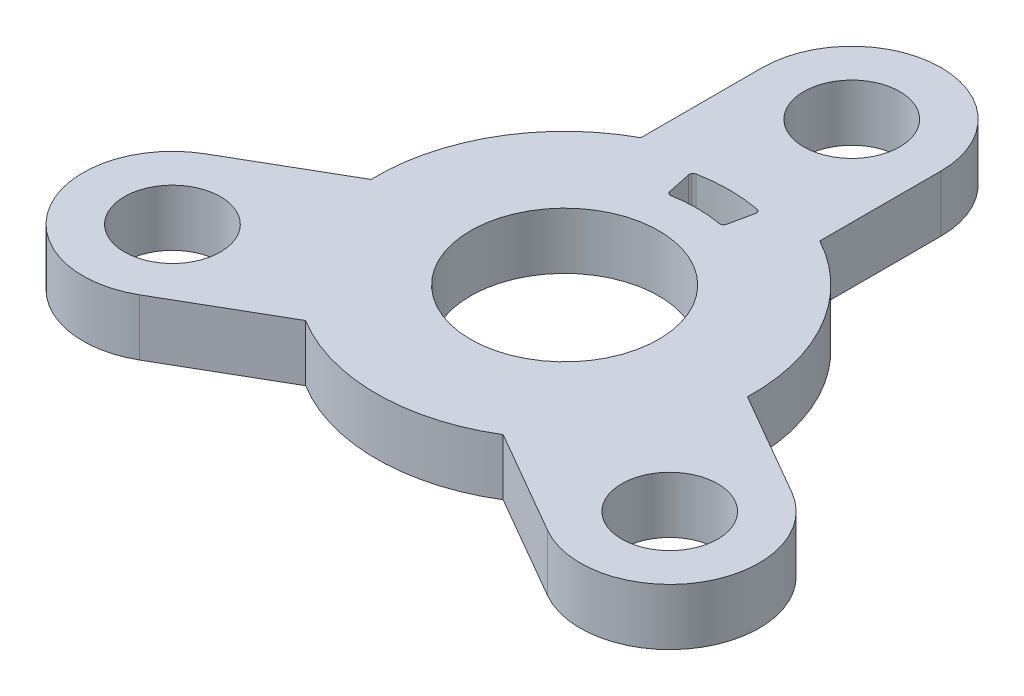
ISO-10303-21;
HEADER;
FILE_DESCRIPTION(('STEP AP214'),'2;1');
FILE_NAME('part.step','',(''),(''),'','','');
FILE_SCHEMA(('AUTOMOTIVE_DESIGN { 1 0 10303 214 1 1 1 1 }'));
ENDSEC;
DATA;
#1=APPLICATION_CONTEXT('core data for automotive mechanical design processes');
#2=APPLICATION_PROTOCOL_DEFINITION('international standard','automotive_design',2000,#1);
#3=PRODUCT_CONTEXT('',#1,'mechanical');
#4=PRODUCT('Part','Part','',(#3));
#5=PRODUCT_RELATED_PRODUCT_CATEGORY('part','',(#4));
#6=PRODUCT_DEFINITION_FORMATION('','',#4);
#7=PRODUCT_DEFINITION_CONTEXT('part definition',#1,'design');
#8=PRODUCT_DEFINITION('design','',#6,#7);
#9=PRODUCT_DEFINITION_SHAPE('','',#8);
#10=(LENGTH_UNIT() NAMED_UNIT(*) SI_UNIT(.MILLI.,.METRE.));
#11=(NAMED_UNIT(*) PLANE_ANGLE_UNIT() SI_UNIT($,.RADIAN.));
#12=(NAMED_UNIT(*) SI_UNIT($,.STERADIAN.) SOLID_ANGLE_UNIT());
#13=UNCERTAINTY_MEASURE_WITH_UNIT(LENGTH_MEASURE(1.E-05),#10,'distance_accuracy_value','');
#14=(GEOMETRIC_REPRESENTATION_CONTEXT(3) GLOBAL_UNCERTAINTY_ASSIGNED_CONTEXT((#13)) GLOBAL_UNIT_ASSIGNED_CONTEXT((#10,
#11,#12)) REPRESENTATION_CONTEXT('',''));
#15=CARTESIAN_POINT('',(0.,0.,0.));
#16=DIRECTION('',(0.,0.,1.));
#17=DIRECTION('',(1.,0.,0.));
#18=AXIS2_PLACEMENT_3D('',#15,#16,#17);
#19=CARTESIAN_POINT('',(0.,3.,0.));
#20=DIRECTION('',(0.,-1.,0.));
#21=DIRECTION('',(0.,0.,-1.));
#22=AXIS2_PLACEMENT_3D('',#19,#20,#21);
#23=CYLINDRICAL_SURFACE('',#22,10.);
#24=CARTESIAN_POINT('',(0.,3.,0.));
#25=DIRECTION('',(0.,1.,0.));
#26=DIRECTION('',(0.,0.,1.));
#27=AXIS2_PLACEMENT_3D('',#24,#25,#26);
#28=CIRCLE('',#27,10.);
#29=CARTESIAN_POINT('',(9.99590053733809,3.,0.286308308723334));
#30=VERTEX_POINT('',#29);
#31=CARTESIAN_POINT('',(4.75,3.,-8.79985795339902));
#32=VERTEX_POINT('',#31);
#33=EDGE_CURVE('E289',#30,#32,#28,.T.);
#34=ORIENTED_EDGE('',*,*,#33,.F.);
#35=DIRECTION('',(0.,1.,0.));
#36=VECTOR('',#35,1.);
#37=CARTESIAN_POINT('',(9.99590053733809,-17.5415408110455,0.286308308723334));
#38=LINE('',#37,#36);
#39=CARTESIAN_POINT('',(9.99590053733809,0.,0.286308308723334));
#40=VERTEX_POINT('',#39);
#41=EDGE_CURVE('E182',#40,#30,#38,.T.);
#42=ORIENTED_EDGE('',*,*,#41,.F.);
#43=CARTESIAN_POINT('',(0.,0.,0.));
#44=DIRECTION('',(0.,1.,0.));
#45=DIRECTION('',(0.,0.,1.));
#46=AXIS2_PLACEMENT_3D('',#43,#44,#45);
#47=CIRCLE('',#46,10.);
#48=CARTESIAN_POINT('',(4.75,0.,-8.79985795339902));
#49=VERTEX_POINT('',#48);
#50=EDGE_CURVE('E282',#40,#49,#47,.T.);
#51=ORIENTED_EDGE('',*,*,#50,.T.);
#52=DIRECTION('',(0.,1.,0.));
#53=VECTOR('',#52,1.);
#54=CARTESIAN_POINT('',(4.75,-14.6864965823725,-8.79985795339902));
#55=LINE('',#54,#53);
#56=EDGE_CURVE('E269',#49,#32,#55,.T.);
#57=ORIENTED_EDGE('',*,*,#56,.T.);
#58=EDGE_LOOP('',(#34,#42,#51,#57));
#59=FACE_BOUND('',#58,.T.);
#60=ADVANCED_FACE('F33',(#59),#23,.T.);
#61=CARTESIAN_POINT('',(-5.24590053733805,0.,8.51354964467562));
#62=VERTEX_POINT('',#61);
#63=CARTESIAN_POINT('',(5.24590053733817,0.,8.51354964467555));
#64=VERTEX_POINT('',#63);
#65=EDGE_CURVE('E292',#62,#64,#47,.T.);
#66=ORIENTED_EDGE('',*,*,#65,.T.);
#67=DIRECTION('',(0.,1.,0.));
#68=VECTOR('',#67,1.);
#69=CARTESIAN_POINT('',(5.24590053733817,-17.5415408110455,8.51354964467555));
#70=LINE('',#69,#68);
#71=CARTESIAN_POINT('',(5.24590053733817,3.,8.51354964467555));
#72=VERTEX_POINT('',#71);
#73=EDGE_CURVE('E208',#64,#72,#70,.T.);
#74=ORIENTED_EDGE('',*,*,#73,.T.);
#75=CARTESIAN_POINT('',(-5.24590053733805,3.,8.51354964467562));
#76=VERTEX_POINT('',#75);
#77=EDGE_CURVE('E288',#76,#72,#28,.T.);
#78=ORIENTED_EDGE('',*,*,#77,.F.);
#79=DIRECTION('',(0.,1.,0.));
#80=VECTOR('',#79,1.);
#81=CARTESIAN_POINT('',(-5.24590053733805,-17.5415408110455,8.51354964467562));
#82=LINE('',#81,#80);
#83=EDGE_CURVE('E240',#62,#76,#82,.T.);
#84=ORIENTED_EDGE('',*,*,#83,.F.);
#85=EDGE_LOOP('',(#66,#74,#78,#84));
#86=FACE_BOUND('',#85,.T.);
#87=ADVANCED_FACE('F364',(#86),#23,.T.);
#88=CARTESIAN_POINT('',(0.,3.,0.));
#89=DIRECTION('',(0.,1.,0.));
#90=DIRECTION('',(0.,0.,1.));
#91=AXIS2_PLACEMENT_3D('',#88,#89,#90);
#92=PLANE('',#91);
#93=CARTESIAN_POINT('',(0.,3.,0.));
#94=DIRECTION('',(0.,-1.,0.));
#95=DIRECTION('',(0.,0.,-1.));
#96=AXIS2_PLACEMENT_3D('',#93,#94,#95);
#97=CIRCLE('',#96,7.05);
#98=CARTESIAN_POINT('',(-1.2749867429514,3.,-6.93375142367378));
#99=VERTEX_POINT('',#98);
#100=CARTESIAN_POINT('',(1.27498674295145,3.,-6.93375142367377));
#101=VERTEX_POINT('',#100);
#102=EDGE_CURVE('E349',#99,#101,#97,.T.);
#103=ORIENTED_EDGE('',*,*,#102,.F.);
#104=CARTESIAN_POINT('',(-1.31115657963088,3.,-7.13045359172126));
#105=DIRECTION('',(0.,1.,0.));
#106=DIRECTION('',(0.,0.,1.));
#107=AXIS2_PLACEMENT_3D('',#104,#105,#106);
#108=CIRCLE('',#107,0.2);
#109=CARTESIAN_POINT('',(-1.50678609977764,3.,-7.08887125355771));
#110=VERTEX_POINT('',#109);
#111=EDGE_CURVE('E311',#99,#110,#108,.F.);
#112=ORIENTED_EDGE('',*,*,#111,.T.);
#113=DIRECTION('',(0.207911690817753,0.,0.978147600733807));
#114=VECTOR('',#113,1.);
#115=CARTESIAN_POINT('',(-1.81922729465534,3.,-8.55879150642081));
#116=LINE('',#115,#114);
#117=CARTESIAN_POINT('',(-1.77715854680823,3.,-8.36087360863124));
#118=VERTEX_POINT('',#117);
#119=EDGE_CURVE('E327',#118,#110,#116,.T.);
#120=ORIENTED_EDGE('',*,*,#119,.F.);
#121=CARTESIAN_POINT('',(-1.58152902666147,3.,-8.4024559467948));
#122=DIRECTION('',(0.,1.,0.));
#123=DIRECTION('',(0.,0.,1.));
#124=AXIS2_PLACEMENT_3D('',#121,#122,#123);
#125=CIRCLE('',#124,0.2);
#126=CARTESIAN_POINT('',(-1.61852385769448,3.,-8.5990046239128));
#127=VERTEX_POINT('',#126);
#128=EDGE_CURVE('E41',#118,#127,#125,.F.);
#129=ORIENTED_EDGE('',*,*,#128,.T.);
#130=CARTESIAN_POINT('',(0.,3.,0.));
#131=DIRECTION('',(0.,1.,0.));
#132=DIRECTION('',(0.,0.,-1.));
#133=AXIS2_PLACEMENT_3D('',#130,#131,#132);
#134=CIRCLE('',#133,8.75);
#135=CARTESIAN_POINT('',(1.61852385769455,3.,-8.59900462391279));
#136=VERTEX_POINT('',#135);
#137=EDGE_CURVE('E325',#136,#127,#134,.T.);
#138=ORIENTED_EDGE('',*,*,#137,.F.);
#139=CARTESIAN_POINT('',(1.58152902666153,3.,-8.40245594679478));
#140=DIRECTION('',(0.,1.,0.));
#141=DIRECTION('',(0.,0.,1.));
#142=AXIS2_PLACEMENT_3D('',#139,#140,#141);
#143=CIRCLE('',#142,0.2);
#144=CARTESIAN_POINT('',(1.77715854680829,3.,-8.36087360863123));
#145=VERTEX_POINT('',#144);
#146=EDGE_CURVE('E319',#136,#145,#143,.F.);
#147=ORIENTED_EDGE('',*,*,#146,.T.);
#148=DIRECTION('',(0.20791169081776,0.,-0.978147600733806));
#149=VECTOR('',#148,1.);
#150=CARTESIAN_POINT('',(1.8192272946554,3.,-8.5587915064208));
#151=LINE('',#150,#149);
#152=CARTESIAN_POINT('',(1.50678609977769,3.,-7.0888712535577));
#153=VERTEX_POINT('',#152);
#154=EDGE_CURVE('E332',#153,#145,#151,.T.);
#155=ORIENTED_EDGE('',*,*,#154,.F.);
#156=CARTESIAN_POINT('',(1.31115657963093,3.,-7.13045359172125));
#157=DIRECTION('',(0.,1.,0.));
#158=DIRECTION('',(0.,0.,1.));
#159=AXIS2_PLACEMENT_3D('',#156,#157,#158);
#160=CIRCLE('',#159,0.2);
#161=EDGE_CURVE('E315',#153,#101,#160,.F.);
#162=ORIENTED_EDGE('',*,*,#161,.T.);
#163=EDGE_LOOP('',(#103,#112,#120,#129,#138,#147,#155,#162));
#164=FACE_BOUND('',#163,.T.);
#165=CARTESIAN_POINT('',(-4.75,3.,-8.79985795339902));
#166=VERTEX_POINT('',#165);
#167=CARTESIAN_POINT('',(-9.99590053733809,3.,0.286308308723472));
#168=VERTEX_POINT('',#167);
#169=EDGE_CURVE('E285',#166,#168,#28,.T.);
#170=ORIENTED_EDGE('',*,*,#169,.T.);
#171=DIRECTION('',(-0.866025403784436,0.,0.500000000000004));
#172=VECTOR('',#171,1.);
#173=CARTESIAN_POINT('',(-15.5818874077127,3.,3.51137933202399));
#174=LINE('',#173,#172);
#175=CARTESIAN_POINT('',(-15.5818874077127,3.,3.51137933202399));
#176=VERTEX_POINT('',#175);
#177=EDGE_CURVE('E233',#168,#176,#174,.T.);
#178=ORIENTED_EDGE('',*,*,#177,.T.);
#179=CARTESIAN_POINT('',(-13.2068874077127,3.,7.62500000000006));
#180=DIRECTION('',(0.,1.,0.));
#181=DIRECTION('',(0.866025403784436,0.,-0.500000000000004));
#182=AXIS2_PLACEMENT_3D('',#179,#180,#181);
#183=CIRCLE('',#182,4.75);
#184=CARTESIAN_POINT('',(-10.8318874077126,3.,11.7386206679761));
#185=VERTEX_POINT('',#184);
#186=EDGE_CURVE('E227',#176,#185,#183,.T.);
#187=ORIENTED_EDGE('',*,*,#186,.T.);
#188=DIRECTION('',(0.866025403784436,0.,-0.500000000000004));
#189=VECTOR('',#188,1.);
#190=CARTESIAN_POINT('',(-10.8318874077126,3.,11.7386206679761));
#191=LINE('',#190,#189);
#192=EDGE_CURVE('E230',#185,#76,#191,.T.);
#193=ORIENTED_EDGE('',*,*,#192,.T.);
#194=ORIENTED_EDGE('',*,*,#77,.T.);
#195=DIRECTION('',(0.866025403784443,0.,0.499999999999992));
#196=VECTOR('',#195,1.);
#197=CARTESIAN_POINT('',(10.8318874077128,3.,11.738620667976));
#198=LINE('',#197,#196);
#199=CARTESIAN_POINT('',(10.8318874077128,3.,11.738620667976));
#200=VERTEX_POINT('',#199);
#201=EDGE_CURVE('E183',#72,#200,#198,.T.);
#202=ORIENTED_EDGE('',*,*,#201,.T.);
#203=CARTESIAN_POINT('',(13.2068874077128,3.,7.62499999999988));
#204=DIRECTION('',(0.,1.,0.));
#205=DIRECTION('',(-0.866025403784443,0.,-0.499999999999992));
#206=AXIS2_PLACEMENT_3D('',#203,#204,#205);
#207=CIRCLE('',#206,4.75);
#208=CARTESIAN_POINT('',(15.5818874077127,3.,3.51137933202377));
#209=VERTEX_POINT('',#208);
#210=EDGE_CURVE('E177',#200,#209,#207,.T.);
#211=ORIENTED_EDGE('',*,*,#210,.T.);
#212=DIRECTION('',(-0.866025403784443,0.,-0.499999999999992));
#213=VECTOR('',#212,1.);
#214=CARTESIAN_POINT('',(15.5818874077127,3.,3.51137933202377));
#215=LINE('',#214,#213);
#216=EDGE_CURVE('E187',#209,#30,#215,.T.);
#217=ORIENTED_EDGE('',*,*,#216,.T.);
#218=ORIENTED_EDGE('',*,*,#33,.T.);
#219=DIRECTION('',(0.,0.,-1.));
#220=VECTOR('',#219,1.);
#221=CARTESIAN_POINT('',(4.75,3.,-15.25));
#222=LINE('',#221,#220);
#223=CARTESIAN_POINT('',(4.75,3.,-15.25));
#224=VERTEX_POINT('',#223);
#225=EDGE_CURVE('E264',#32,#224,#222,.T.);
#226=ORIENTED_EDGE('',*,*,#225,.T.);
#227=CARTESIAN_POINT('',(0.,3.,-15.25));
#228=DIRECTION('',(0.,1.,0.));
#229=DIRECTION('',(0.,0.,1.));
#230=AXIS2_PLACEMENT_3D('',#227,#228,#229);
#231=CIRCLE('',#230,4.75);
#232=CARTESIAN_POINT('',(-4.75,3.,-15.25));
#233=VERTEX_POINT('',#232);
#234=EDGE_CURVE('E258',#224,#233,#231,.T.);
#235=ORIENTED_EDGE('',*,*,#234,.T.);
#236=DIRECTION('',(0.,0.,1.));
#237=VECTOR('',#236,1.);
#238=CARTESIAN_POINT('',(-4.75,3.,-15.25));
#239=LINE('',#238,#237);
#240=EDGE_CURVE('E261',#233,#166,#239,.T.);
#241=ORIENTED_EDGE('',*,*,#240,.T.);
#242=EDGE_LOOP('',(#170,#178,#187,#193,#194,#202,#211,#217,#218,#226,#235,#241));
#243=FACE_BOUND('',#242,.T.);
#244=CARTESIAN_POINT('',(0.,3.,0.));
#245=DIRECTION('',(0.,1.,0.));
#246=DIRECTION('',(0.,0.,1.));
#247=AXIS2_PLACEMENT_3D('',#244,#245,#246);
#248=CIRCLE('',#247,5.);
#249=CARTESIAN_POINT('',(0.,3.,5.));
#250=VERTEX_POINT('',#249);
#251=EDGE_CURVE('E279',#250,#250,#248,.T.);
#252=ORIENTED_EDGE('',*,*,#251,.F.);
#253=EDGE_LOOP('',(#252));
#254=FACE_BOUND('',#253,.T.);
#255=CARTESIAN_POINT('',(0.,3.,-15.25));
#256=DIRECTION('',(0.,1.,0.));
#257=DIRECTION('',(0.,0.,1.));
#258=AXIS2_PLACEMENT_3D('',#255,#256,#257);
#259=CIRCLE('',#258,2.55);
#260=CARTESIAN_POINT('',(0.,3.,-12.7));
#261=VERTEX_POINT('',#260);
#262=EDGE_CURVE('E246',#261,#261,#259,.T.);
#263=ORIENTED_EDGE('',*,*,#262,.F.);
#264=EDGE_LOOP('',(#263));
#265=FACE_BOUND('',#264,.T.);
#266=CARTESIAN_POINT('',(-13.2068874077127,3.,7.62500000000006));
#267=DIRECTION('',(0.,1.,0.));
#268=DIRECTION('',(0.866025403784436,0.,-0.500000000000004));
#269=AXIS2_PLACEMENT_3D('',#266,#267,#268);
#270=CIRCLE('',#269,2.55);
#271=CARTESIAN_POINT('',(-13.2068874077127,3.,10.1750000000001));
#272=VERTEX_POINT('',#271);
#273=EDGE_CURVE('E214',#272,#272,#270,.T.);
#274=ORIENTED_EDGE('',*,*,#273,.F.);
#275=EDGE_LOOP('',(#274));
#276=FACE_BOUND('',#275,.T.);
#277=CARTESIAN_POINT('',(13.2068874077128,3.,7.62499999999988));
#278=DIRECTION('',(0.,1.,0.));
#279=DIRECTION('',(-0.866025403784443,0.,-0.499999999999992));
#280=AXIS2_PLACEMENT_3D('',#277,#278,#279);
#281=CIRCLE('',#280,2.55);
#282=CARTESIAN_POINT('',(10.9985226280624,3.,6.3499999999999));
#283=VERTEX_POINT('',#282);
#284=EDGE_CURVE('E197',#283,#283,#281,.T.);
#285=ORIENTED_EDGE('',*,*,#284,.F.);
#286=EDGE_LOOP('',(#285));
#287=FACE_BOUND('',#286,.T.);
#288=ADVANCED_FACE('F193',(#164,#243,#254,#265,#276,#287),#92,.T.);
#289=CARTESIAN_POINT('',(0.,0.,0.));
#290=DIRECTION('',(0.,1.,0.));
#291=DIRECTION('',(0.,0.,1.));
#292=AXIS2_PLACEMENT_3D('',#289,#290,#291);
#293=PLANE('',#292);
#294=CARTESIAN_POINT('',(0.,0.,0.));
#295=DIRECTION('',(0.,1.,0.));
#296=DIRECTION('',(0.,0.,-1.));
#297=AXIS2_PLACEMENT_3D('',#294,#295,#296);
#298=CIRCLE('',#297,8.75);
#299=CARTESIAN_POINT('',(1.61852385769455,0.,-8.59900462391279));
#300=VERTEX_POINT('',#299);
#301=CARTESIAN_POINT('',(-1.61852385769448,0.,-8.5990046239128));
#302=VERTEX_POINT('',#301);
#303=EDGE_CURVE('E340',#300,#302,#298,.T.);
#304=ORIENTED_EDGE('',*,*,#303,.T.);
#305=CARTESIAN_POINT('',(-1.58152902666147,0.,-8.4024559467948));
#306=DIRECTION('',(0.,1.,0.));
#307=DIRECTION('',(0.,0.,1.));
#308=AXIS2_PLACEMENT_3D('',#305,#306,#307);
#309=CIRCLE('',#308,0.2);
#310=CARTESIAN_POINT('',(-1.77715854680823,0.,-8.36087360863124));
#311=VERTEX_POINT('',#310);
#312=EDGE_CURVE('E11',#302,#311,#309,.T.);
#313=ORIENTED_EDGE('',*,*,#312,.T.);
#314=DIRECTION('',(0.207911690817753,0.,0.978147600733807));
#315=VECTOR('',#314,1.);
#316=CARTESIAN_POINT('',(-1.81922729465534,0.,-8.55879150642081));
#317=LINE('',#316,#315);
#318=CARTESIAN_POINT('',(-1.50678609977764,0.,-7.08887125355771));
#319=VERTEX_POINT('',#318);
#320=EDGE_CURVE('E200',#311,#319,#317,.T.);
#321=ORIENTED_EDGE('',*,*,#320,.T.);
#322=CARTESIAN_POINT('',(-1.31115657963088,0.,-7.13045359172126));
#323=DIRECTION('',(0.,1.,0.));
#324=DIRECTION('',(0.,0.,1.));
#325=AXIS2_PLACEMENT_3D('',#322,#323,#324);
#326=CIRCLE('',#325,0.2);
#327=CARTESIAN_POINT('',(-1.2749867429514,0.,-6.93375142367378));
#328=VERTEX_POINT('',#327);
#329=EDGE_CURVE('E313',#319,#328,#326,.T.);
#330=ORIENTED_EDGE('',*,*,#329,.T.);
#331=CARTESIAN_POINT('',(0.,0.,0.));
#332=DIRECTION('',(0.,-1.,0.));
#333=DIRECTION('',(0.,0.,-1.));
#334=AXIS2_PLACEMENT_3D('',#331,#332,#333);
#335=CIRCLE('',#334,7.05);
#336=CARTESIAN_POINT('',(1.27498674295145,0.,-6.93375142367377));
#337=VERTEX_POINT('',#336);
#338=EDGE_CURVE('E355',#328,#337,#335,.T.);
#339=ORIENTED_EDGE('',*,*,#338,.T.);
#340=CARTESIAN_POINT('',(1.31115657963093,0.,-7.13045359172125));
#341=DIRECTION('',(0.,1.,0.));
#342=DIRECTION('',(0.,0.,1.));
#343=AXIS2_PLACEMENT_3D('',#340,#341,#342);
#344=CIRCLE('',#343,0.2);
#345=CARTESIAN_POINT('',(1.50678609977769,0.,-7.0888712535577));
#346=VERTEX_POINT('',#345);
#347=EDGE_CURVE('E317',#337,#346,#344,.T.);
#348=ORIENTED_EDGE('',*,*,#347,.T.);
#349=DIRECTION('',(0.20791169081776,0.,-0.978147600733806));
#350=VECTOR('',#349,1.);
#351=CARTESIAN_POINT('',(1.8192272946554,0.,-8.5587915064208));
#352=LINE('',#351,#350);
#353=CARTESIAN_POINT('',(1.77715854680829,0.,-8.36087360863123));
#354=VERTEX_POINT('',#353);
#355=EDGE_CURVE('E345',#346,#354,#352,.T.);
#356=ORIENTED_EDGE('',*,*,#355,.T.);
#357=CARTESIAN_POINT('',(1.58152902666153,0.,-8.40245594679478));
#358=DIRECTION('',(0.,1.,0.));
#359=DIRECTION('',(0.,0.,1.));
#360=AXIS2_PLACEMENT_3D('',#357,#358,#359);
#361=CIRCLE('',#360,0.2);
#362=EDGE_CURVE('E55',#354,#300,#361,.T.);
#363=ORIENTED_EDGE('',*,*,#362,.T.);
#364=EDGE_LOOP('',(#304,#313,#321,#330,#339,#348,#356,#363));
#365=FACE_BOUND('',#364,.T.);
#366=CARTESIAN_POINT('',(-4.75,0.,-8.79985795339902));
#367=VERTEX_POINT('',#366);
#368=CARTESIAN_POINT('',(-9.99590053733809,0.,0.286308308723473));
#369=VERTEX_POINT('',#368);
#370=EDGE_CURVE('E290',#367,#369,#47,.T.);
#371=ORIENTED_EDGE('',*,*,#370,.F.);
#372=DIRECTION('',(0.,0.,-1.));
#373=VECTOR('',#372,1.);
#374=CARTESIAN_POINT('',(-4.75,0.,-15.25));
#375=LINE('',#374,#373);
#376=CARTESIAN_POINT('',(-4.75,0.,-15.25));
#377=VERTEX_POINT('',#376);
#378=EDGE_CURVE('E247',#367,#377,#375,.T.);
#379=ORIENTED_EDGE('',*,*,#378,.T.);
#380=CARTESIAN_POINT('',(0.,0.,-15.25));
#381=DIRECTION('',(0.,1.,0.));
#382=DIRECTION('',(0.,0.,1.));
#383=AXIS2_PLACEMENT_3D('',#380,#381,#382);
#384=CIRCLE('',#383,4.75);
#385=CARTESIAN_POINT('',(4.75,0.,-15.25));
#386=VERTEX_POINT('',#385);
#387=EDGE_CURVE('E250',#377,#386,#384,.F.);
#388=ORIENTED_EDGE('',*,*,#387,.T.);
#389=DIRECTION('',(0.,0.,1.));
#390=VECTOR('',#389,1.);
#391=CARTESIAN_POINT('',(4.75,0.,-15.25));
#392=LINE('',#391,#390);
#393=EDGE_CURVE('E251',#386,#49,#392,.T.);
#394=ORIENTED_EDGE('',*,*,#393,.T.);
#395=ORIENTED_EDGE('',*,*,#50,.F.);
#396=DIRECTION('',(0.866025403784443,0.,0.499999999999992));
#397=VECTOR('',#396,1.);
#398=CARTESIAN_POINT('',(15.5818874077127,0.,3.51137933202377));
#399=LINE('',#398,#397);
#400=CARTESIAN_POINT('',(15.5818874077127,0.,3.51137933202377));
#401=VERTEX_POINT('',#400);
#402=EDGE_CURVE('E215',#40,#401,#399,.T.);
#403=ORIENTED_EDGE('',*,*,#402,.T.);
#404=CARTESIAN_POINT('',(13.2068874077128,0.,7.62499999999988));
#405=DIRECTION('',(0.,1.,0.));
#406=DIRECTION('',(0.,0.,1.));
#407=AXIS2_PLACEMENT_3D('',#404,#405,#406);
#408=CIRCLE('',#407,4.75);
#409=CARTESIAN_POINT('',(10.8318874077128,0.,11.738620667976));
#410=VERTEX_POINT('',#409);
#411=EDGE_CURVE('E179',#401,#410,#408,.F.);
#412=ORIENTED_EDGE('',*,*,#411,.T.);
#413=DIRECTION('',(-0.866025403784443,0.,-0.499999999999992));
#414=VECTOR('',#413,1.);
#415=CARTESIAN_POINT('',(10.8318874077128,0.,11.738620667976));
#416=LINE('',#415,#414);
#417=EDGE_CURVE('E207',#410,#64,#416,.T.);
#418=ORIENTED_EDGE('',*,*,#417,.T.);
#419=ORIENTED_EDGE('',*,*,#65,.F.);
#420=DIRECTION('',(-0.866025403784436,0.,0.500000000000004));
#421=VECTOR('',#420,1.);
#422=CARTESIAN_POINT('',(-10.8318874077126,0.,11.7386206679761));
#423=LINE('',#422,#421);
#424=CARTESIAN_POINT('',(-10.8318874077126,0.,11.7386206679761));
#425=VERTEX_POINT('',#424);
#426=EDGE_CURVE('E216',#62,#425,#423,.T.);
#427=ORIENTED_EDGE('',*,*,#426,.T.);
#428=CARTESIAN_POINT('',(-13.2068874077127,0.,7.62500000000006));
#429=DIRECTION('',(0.,1.,0.));
#430=DIRECTION('',(0.,0.,1.));
#431=AXIS2_PLACEMENT_3D('',#428,#429,#430);
#432=CIRCLE('',#431,4.75);
#433=CARTESIAN_POINT('',(-15.5818874077127,0.,3.51137933202399));
#434=VERTEX_POINT('',#433);
#435=EDGE_CURVE('E219',#425,#434,#432,.F.);
#436=ORIENTED_EDGE('',*,*,#435,.T.);
#437=DIRECTION('',(0.866025403784436,0.,-0.500000000000004));
#438=VECTOR('',#437,1.);
#439=CARTESIAN_POINT('',(-15.5818874077127,0.,3.51137933202399));
#440=LINE('',#439,#438);
#441=EDGE_CURVE('E220',#434,#369,#440,.T.);
#442=ORIENTED_EDGE('',*,*,#441,.T.);
#443=EDGE_LOOP('',(#371,#379,#388,#394,#395,#403,#412,#418,#419,#427,#436,#442));
#444=FACE_BOUND('',#443,.T.);
#445=CARTESIAN_POINT('',(0.,0.,0.));
#446=DIRECTION('',(0.,1.,0.));
#447=DIRECTION('',(0.,0.,1.));
#448=AXIS2_PLACEMENT_3D('',#445,#446,#447);
#449=CIRCLE('',#448,5.);
#450=CARTESIAN_POINT('',(0.,0.,5.));
#451=VERTEX_POINT('',#450);
#452=EDGE_CURVE('E278',#451,#451,#449,.T.);
#453=ORIENTED_EDGE('',*,*,#452,.T.);
#454=EDGE_LOOP('',(#453));
#455=FACE_BOUND('',#454,.T.);
#456=CARTESIAN_POINT('',(0.,0.,-15.25));
#457=DIRECTION('',(0.,1.,0.));
#458=DIRECTION('',(0.,0.,1.));
#459=AXIS2_PLACEMENT_3D('',#456,#457,#458);
#460=CIRCLE('',#459,2.55);
#461=CARTESIAN_POINT('',(0.,0.,-12.7));
#462=VERTEX_POINT('',#461);
#463=EDGE_CURVE('E249',#462,#462,#460,.F.);
#464=ORIENTED_EDGE('',*,*,#463,.F.);
#465=EDGE_LOOP('',(#464));
#466=FACE_BOUND('',#465,.T.);
#467=CARTESIAN_POINT('',(-13.2068874077127,0.,7.62500000000006));
#468=DIRECTION('',(0.,1.,0.));
#469=DIRECTION('',(0.,0.,1.));
#470=AXIS2_PLACEMENT_3D('',#467,#468,#469);
#471=CIRCLE('',#470,2.55);
#472=CARTESIAN_POINT('',(-13.2068874077127,0.,10.1750000000001));
#473=VERTEX_POINT('',#472);
#474=EDGE_CURVE('E218',#473,#473,#471,.F.);
#475=ORIENTED_EDGE('',*,*,#474,.F.);
#476=EDGE_LOOP('',(#475));
#477=FACE_BOUND('',#476,.T.);
#478=CARTESIAN_POINT('',(13.2068874077128,0.,7.62499999999988));
#479=DIRECTION('',(0.,1.,0.));
#480=DIRECTION('',(0.,0.,1.));
#481=AXIS2_PLACEMENT_3D('',#478,#479,#480);
#482=CIRCLE('',#481,2.55);
#483=CARTESIAN_POINT('',(13.2068874077128,0.,10.1749999999999));
#484=VERTEX_POINT('',#483);
#485=EDGE_CURVE('E211',#484,#484,#482,.F.);
#486=ORIENTED_EDGE('',*,*,#485,.F.);
#487=EDGE_LOOP('',(#486));
#488=FACE_BOUND('',#487,.T.);
#489=ADVANCED_FACE('F337',(#365,#444,#455,#466,#477,#488),#293,.F.);
#490=ORIENTED_EDGE('',*,*,#370,.T.);
#491=DIRECTION('',(0.,1.,0.));
#492=VECTOR('',#491,1.);
#493=CARTESIAN_POINT('',(-9.99590053733809,-17.5415408110455,0.286308308723472));
#494=LINE('',#493,#492);
#495=EDGE_CURVE('E238',#369,#168,#494,.T.);
#496=ORIENTED_EDGE('',*,*,#495,.T.);
#497=ORIENTED_EDGE('',*,*,#169,.F.);
#498=DIRECTION('',(0.,1.,0.));
#499=VECTOR('',#498,1.);
#500=CARTESIAN_POINT('',(-4.75,-14.6864965823725,-8.79985795339902));
#501=LINE('',#500,#499);
#502=EDGE_CURVE('E272',#367,#166,#501,.T.);
#503=ORIENTED_EDGE('',*,*,#502,.F.);
#504=EDGE_LOOP('',(#490,#496,#497,#503));
#505=FACE_BOUND('',#504,.T.);
#506=ADVANCED_FACE('F386',(#505),#23,.T.);
#507=CARTESIAN_POINT('',(0.,3.,0.));
#508=DIRECTION('',(0.,-1.,0.));
#509=DIRECTION('',(0.,0.,-1.));
#510=AXIS2_PLACEMENT_3D('',#507,#508,#509);
#511=CYLINDRICAL_SURFACE('',#510,5.);
#512=ORIENTED_EDGE('',*,*,#251,.T.);
#513=EDGE_LOOP('',(#512));
#514=FACE_BOUND('',#513,.T.);
#515=ORIENTED_EDGE('',*,*,#452,.F.);
#516=EDGE_LOOP('',(#515));
#517=FACE_BOUND('',#516,.T.);
#518=ADVANCED_FACE('F419',(#514,#517),#511,.F.);
#519=CARTESIAN_POINT('',(-4.75,-14.6864965823725,-15.25));
#520=DIRECTION('',(-1.,0.,0.));
#521=DIRECTION('',(0.,0.,1.));
#522=AXIS2_PLACEMENT_3D('',#519,#520,#521);
#523=PLANE('',#522);
#524=ORIENTED_EDGE('',*,*,#378,.F.);
#525=ORIENTED_EDGE('',*,*,#502,.T.);
#526=ORIENTED_EDGE('',*,*,#240,.F.);
#527=DIRECTION('',(0.,1.,0.));
#528=VECTOR('',#527,1.);
#529=CARTESIAN_POINT('',(-4.75,-14.6864965823725,-15.25));
#530=LINE('',#529,#528);
#531=EDGE_CURVE('E267',#377,#233,#530,.T.);
#532=ORIENTED_EDGE('',*,*,#531,.F.);
#533=EDGE_LOOP('',(#524,#525,#526,#532));
#534=FACE_BOUND('',#533,.T.);
#535=ADVANCED_FACE('F383',(#534),#523,.T.);
#536=CARTESIAN_POINT('',(4.75,-14.6864965823725,-15.25));
#537=DIRECTION('',(1.,0.,0.));
#538=DIRECTION('',(0.,0.,-1.));
#539=AXIS2_PLACEMENT_3D('',#536,#537,#538);
#540=PLANE('',#539);
#541=ORIENTED_EDGE('',*,*,#393,.F.);
#542=DIRECTION('',(0.,1.,0.));
#543=VECTOR('',#542,1.);
#544=CARTESIAN_POINT('',(4.75,-14.6864965823725,-15.25));
#545=LINE('',#544,#543);
#546=EDGE_CURVE('E254',#386,#224,#545,.T.);
#547=ORIENTED_EDGE('',*,*,#546,.T.);
#548=ORIENTED_EDGE('',*,*,#225,.F.);
#549=ORIENTED_EDGE('',*,*,#56,.F.);
#550=EDGE_LOOP('',(#541,#547,#548,#549));
#551=FACE_BOUND('',#550,.T.);
#552=ADVANCED_FACE('F372',(#551),#540,.T.);
#553=CARTESIAN_POINT('',(0.,-14.6864965823725,-15.25));
#554=DIRECTION('',(0.,1.,0.));
#555=DIRECTION('',(0.,0.,1.));
#556=AXIS2_PLACEMENT_3D('',#553,#554,#555);
#557=CYLINDRICAL_SURFACE('',#556,4.75);
#558=ORIENTED_EDGE('',*,*,#387,.F.);
#559=ORIENTED_EDGE('',*,*,#531,.T.);
#560=ORIENTED_EDGE('',*,*,#234,.F.);
#561=ORIENTED_EDGE('',*,*,#546,.F.);
#562=EDGE_LOOP('',(#558,#559,#560,#561));
#563=FACE_BOUND('',#562,.T.);
#564=ADVANCED_FACE('F377',(#563),#557,.T.);
#565=CARTESIAN_POINT('',(0.,-14.6864965823725,-15.25));
#566=DIRECTION('',(0.,1.,0.));
#567=DIRECTION('',(0.,0.,1.));
#568=AXIS2_PLACEMENT_3D('',#565,#566,#567);
#569=CYLINDRICAL_SURFACE('',#568,2.55);
#570=ORIENTED_EDGE('',*,*,#463,.T.);
#571=EDGE_LOOP('',(#570));
#572=FACE_BOUND('',#571,.T.);
#573=ORIENTED_EDGE('',*,*,#262,.T.);
#574=EDGE_LOOP('',(#573));
#575=FACE_BOUND('',#574,.T.);
#576=ADVANCED_FACE('F401',(#572,#575),#569,.F.);
#577=CARTESIAN_POINT('',(-10.8318874077126,-17.5415408110455,11.7386206679761));
#578=DIRECTION('',(0.500000000000004,0.,0.866025403784436));
#579=DIRECTION('',(0.866025403784436,0.,-0.500000000000004));
#580=AXIS2_PLACEMENT_3D('',#577,#578,#579);
#581=PLANE('',#580);
#582=ORIENTED_EDGE('',*,*,#426,.F.);
#583=ORIENTED_EDGE('',*,*,#83,.T.);
#584=ORIENTED_EDGE('',*,*,#192,.F.);
#585=DIRECTION('',(0.,1.,0.));
#586=VECTOR('',#585,1.);
#587=CARTESIAN_POINT('',(-10.8318874077126,-17.5415408110455,11.7386206679761));
#588=LINE('',#587,#586);
#589=EDGE_CURVE('E236',#425,#185,#588,.T.);
#590=ORIENTED_EDGE('',*,*,#589,.F.);
#591=EDGE_LOOP('',(#582,#583,#584,#590));
#592=FACE_BOUND('',#591,.T.);
#593=ADVANCED_FACE('F399',(#592),#581,.T.);
#594=CARTESIAN_POINT('',(-15.5818874077127,-17.5415408110455,3.51137933202399));
#595=DIRECTION('',(-0.500000000000004,0.,-0.866025403784436));
#596=DIRECTION('',(-0.866025403784436,0.,0.500000000000004));
#597=AXIS2_PLACEMENT_3D('',#594,#595,#596);
#598=PLANE('',#597);
#599=ORIENTED_EDGE('',*,*,#441,.F.);
#600=DIRECTION('',(0.,1.,0.));
#601=VECTOR('',#600,1.);
#602=CARTESIAN_POINT('',(-15.5818874077127,-17.5415408110455,3.51137933202399));
#603=LINE('',#602,#601);
#604=EDGE_CURVE('E223',#434,#176,#603,.T.);
#605=ORIENTED_EDGE('',*,*,#604,.T.);
#606=ORIENTED_EDGE('',*,*,#177,.F.);
#607=ORIENTED_EDGE('',*,*,#495,.F.);
#608=EDGE_LOOP('',(#599,#605,#606,#607));
#609=FACE_BOUND('',#608,.T.);
#610=ADVANCED_FACE('F390',(#609),#598,.T.);
#611=CARTESIAN_POINT('',(-13.2068874077127,-17.5415408110455,7.62500000000006));
#612=DIRECTION('',(0.,1.,0.));
#613=DIRECTION('',(0.,0.,1.));
#614=AXIS2_PLACEMENT_3D('',#611,#612,#613);
#615=CYLINDRICAL_SURFACE('',#614,4.75);
#616=ORIENTED_EDGE('',*,*,#435,.F.);
#617=ORIENTED_EDGE('',*,*,#589,.T.);
#618=ORIENTED_EDGE('',*,*,#186,.F.);
#619=ORIENTED_EDGE('',*,*,#604,.F.);
#620=EDGE_LOOP('',(#616,#617,#618,#619));
#621=FACE_BOUND('',#620,.T.);
#622=ADVANCED_FACE('F395',(#621),#615,.T.);
#623=CARTESIAN_POINT('',(-13.2068874077127,-17.5415408110455,7.62500000000006));
#624=DIRECTION('',(0.,1.,0.));
#625=DIRECTION('',(0.,0.,1.));
#626=AXIS2_PLACEMENT_3D('',#623,#624,#625);
#627=CYLINDRICAL_SURFACE('',#626,2.55);
#628=CARTESIAN_POINT('',(-13.2068874077127,0.,10.1750000000001));
#629=CARTESIAN_POINT('',(-13.2068874077127,0.03125,10.1750000000001));
#630=CARTESIAN_POINT('',(-13.2068874077127,0.0625000000000001,10.1750000000001));
#631=CARTESIAN_POINT('',(-13.2068874077127,0.125,10.1750000000001));
#632=CARTESIAN_POINT('',(-13.2068874077127,0.15625,10.1750000000001));
#633=CARTESIAN_POINT('',(-13.2068874077127,0.21875,10.1750000000001));
#634=CARTESIAN_POINT('',(-13.2068874077127,0.25,10.1750000000001));
#635=CARTESIAN_POINT('',(-13.2068874077127,0.3125,10.1750000000001));
#636=CARTESIAN_POINT('',(-13.2068874077127,0.34375,10.1750000000001));
#637=CARTESIAN_POINT('',(-13.2068874077127,0.40625,10.1750000000001));
#638=CARTESIAN_POINT('',(-13.2068874077127,0.4375,10.1750000000001));
#639=CARTESIAN_POINT('',(-13.2068874077127,0.5,10.1750000000001));
#640=CARTESIAN_POINT('',(-13.2068874077127,0.53125,10.1750000000001));
#641=CARTESIAN_POINT('',(-13.2068874077127,0.593750000000001,10.1750000000001));
#642=CARTESIAN_POINT('',(-13.2068874077127,0.625000000000001,10.1750000000001));
#643=CARTESIAN_POINT('',(-13.2068874077127,0.687500000000001,10.1750000000001));
#644=CARTESIAN_POINT('',(-13.2068874077127,0.718750000000001,10.1750000000001));
#645=CARTESIAN_POINT('',(-13.2068874077127,0.781250000000001,10.1750000000001));
#646=CARTESIAN_POINT('',(-13.2068874077127,0.812500000000001,10.1750000000001));
#647=CARTESIAN_POINT('',(-13.2068874077127,0.875000000000001,10.1750000000001));
#648=CARTESIAN_POINT('',(-13.2068874077127,0.906250000000001,10.1750000000001));
#649=CARTESIAN_POINT('',(-13.2068874077127,0.968750000000001,10.1750000000001));
#650=CARTESIAN_POINT('',(-13.2068874077127,1.,10.1750000000001));
#651=CARTESIAN_POINT('',(-13.2068874077127,1.0625,10.1750000000001));
#652=CARTESIAN_POINT('',(-13.2068874077127,1.09375,10.1750000000001));
#653=CARTESIAN_POINT('',(-13.2068874077127,1.15625,10.1750000000001));
#654=CARTESIAN_POINT('',(-13.2068874077127,1.1875,10.1750000000001));
#655=CARTESIAN_POINT('',(-13.2068874077127,1.25,10.1750000000001));
#656=CARTESIAN_POINT('',(-13.2068874077127,1.28125,10.1750000000001));
#657=CARTESIAN_POINT('',(-13.2068874077127,1.34375,10.1750000000001));
#658=CARTESIAN_POINT('',(-13.2068874077127,1.375,10.1750000000001));
#659=CARTESIAN_POINT('',(-13.2068874077127,1.4375,10.1750000000001));
#660=CARTESIAN_POINT('',(-13.2068874077127,1.46875,10.1750000000001));
#661=CARTESIAN_POINT('',(-13.2068874077127,1.53125,10.1750000000001));
#662=CARTESIAN_POINT('',(-13.2068874077127,1.5625,10.1750000000001));
#663=CARTESIAN_POINT('',(-13.2068874077127,1.625,10.1750000000001));
#664=CARTESIAN_POINT('',(-13.2068874077127,1.65625,10.1750000000001));
#665=CARTESIAN_POINT('',(-13.2068874077127,1.71875,10.1750000000001));
#666=CARTESIAN_POINT('',(-13.2068874077127,1.75,10.1750000000001));
#667=CARTESIAN_POINT('',(-13.2068874077127,1.8125,10.1750000000001));
#668=CARTESIAN_POINT('',(-13.2068874077127,1.84375,10.1750000000001));
#669=CARTESIAN_POINT('',(-13.2068874077127,1.90625,10.1750000000001));
#670=CARTESIAN_POINT('',(-13.2068874077127,1.9375,10.1750000000001));
#671=CARTESIAN_POINT('',(-13.2068874077127,2.,10.1750000000001));
#672=CARTESIAN_POINT('',(-13.2068874077127,2.03125,10.1750000000001));
#673=CARTESIAN_POINT('',(-13.2068874077127,2.09375,10.1750000000001));
#674=CARTESIAN_POINT('',(-13.2068874077127,2.125,10.1750000000001));
#675=CARTESIAN_POINT('',(-13.2068874077127,2.1875,10.1750000000001));
#676=CARTESIAN_POINT('',(-13.2068874077127,2.21875,10.1750000000001));
#677=CARTESIAN_POINT('',(-13.2068874077127,2.28125,10.1750000000001));
#678=CARTESIAN_POINT('',(-13.2068874077127,2.3125,10.1750000000001));
#679=CARTESIAN_POINT('',(-13.2068874077127,2.375,10.1750000000001));
#680=CARTESIAN_POINT('',(-13.2068874077127,2.40625,10.1750000000001));
#681=CARTESIAN_POINT('',(-13.2068874077127,2.46875,10.1750000000001));
#682=CARTESIAN_POINT('',(-13.2068874077127,2.5,10.1750000000001));
#683=CARTESIAN_POINT('',(-13.2068874077127,2.5625,10.1750000000001));
#684=CARTESIAN_POINT('',(-13.2068874077127,2.59375,10.1750000000001));
#685=CARTESIAN_POINT('',(-13.2068874077127,2.65625,10.1750000000001));
#686=CARTESIAN_POINT('',(-13.2068874077127,2.6875,10.1750000000001));
#687=CARTESIAN_POINT('',(-13.2068874077127,2.75,10.1750000000001));
#688=CARTESIAN_POINT('',(-13.2068874077127,2.78125,10.1750000000001));
#689=CARTESIAN_POINT('',(-13.2068874077127,2.84375,10.1750000000001));
#690=CARTESIAN_POINT('',(-13.2068874077127,2.875,10.1750000000001));
#691=CARTESIAN_POINT('',(-13.2068874077127,2.9375,10.1750000000001));
#692=CARTESIAN_POINT('',(-13.2068874077127,2.96875,10.1750000000001));
#693=CARTESIAN_POINT('',(-13.2068874077127,3.,10.1750000000001));
#694=B_SPLINE_CURVE_WITH_KNOTS('',3,(#628,#629,#630,#631,#632,#633,#634,#635,#636,#637,#638,
#639,#640,#641,#642,#643,#644,#645,#646,#647,#648,#649,#650,#651,#652,#653,#654,#655,#656,#657,
#658,#659,#660,#661,#662,#663,#664,#665,#666,#667,#668,#669,#670,#671,#672,#673,#674,#675,#676,
#677,#678,#679,#680,#681,#682,#683,#684,#685,#686,#687,#688,#689,#690,#691,#692,#693),
.UNSPECIFIED.,.F.,.F.,(4,2,2,2,2,2,2,2,2,2,2,2,2,2,2,2,2,2,2,2,2,2,2,2,2,2,2,2,2,2,2,2,4),(0.,
0.0937500000000001,0.1875,0.28125,0.375,0.46875,0.5625,0.656250000000001,0.750000000000001,
0.843750000000001,0.937500000000001,1.03125,1.125,1.21875,1.3125,1.40625,1.5,1.59375,1.6875,
1.78125,1.875,1.96875,2.0625,2.15625,2.25,2.34375,2.4375,2.53125,2.625,2.71875,2.8125,2.90625,
3.),.UNSPECIFIED.);
#695=EDGE_CURVE('BSEAM437',#473,#272,#694,.T.);
#696=ORIENTED_EDGE('',*,*,#474,.T.);
#697=ORIENTED_EDGE('',*,*,#273,.T.);
#698=ORIENTED_EDGE('',*,*,#695,.T.);
#699=ORIENTED_EDGE('',*,*,#695,.F.);
#700=EDGE_LOOP('',(#696,#698,#697,#699));
#701=FACE_BOUND('',#700,.T.);
#702=ADVANCED_FACE('F437',(#701),#627,.F.);
#703=CARTESIAN_POINT('',(15.5818874077127,-17.5415408110455,3.51137933202377));
#704=DIRECTION('',(0.499999999999992,0.,-0.866025403784443));
#705=DIRECTION('',(-0.866025403784443,0.,-0.499999999999992));
#706=AXIS2_PLACEMENT_3D('',#703,#704,#705);
#707=PLANE('',#706);
#708=ORIENTED_EDGE('',*,*,#402,.F.);
#709=ORIENTED_EDGE('',*,*,#41,.T.);
#710=ORIENTED_EDGE('',*,*,#216,.F.);
#711=DIRECTION('',(0.,1.,0.));
#712=VECTOR('',#711,1.);
#713=CARTESIAN_POINT('',(15.5818874077127,-17.5415408110455,3.51137933202377));
#714=LINE('',#713,#712);
#715=EDGE_CURVE('E172',#401,#209,#714,.T.);
#716=ORIENTED_EDGE('',*,*,#715,.F.);
#717=EDGE_LOOP('',(#708,#709,#710,#716));
#718=FACE_BOUND('',#717,.T.);
#719=ADVANCED_FACE('F188',(#718),#707,.T.);
#720=CARTESIAN_POINT('',(10.8318874077128,-17.5415408110455,11.738620667976));
#721=DIRECTION('',(-0.499999999999992,0.,0.866025403784443));
#722=DIRECTION('',(0.866025403784443,0.,0.499999999999992));
#723=AXIS2_PLACEMENT_3D('',#720,#721,#722);
#724=PLANE('',#723);
#725=ORIENTED_EDGE('',*,*,#417,.F.);
#726=DIRECTION('',(0.,1.,0.));
#727=VECTOR('',#726,1.);
#728=CARTESIAN_POINT('',(10.8318874077128,-17.5415408110455,11.738620667976));
#729=LINE('',#728,#727);
#730=EDGE_CURVE('E205',#410,#200,#729,.T.);
#731=ORIENTED_EDGE('',*,*,#730,.T.);
#732=ORIENTED_EDGE('',*,*,#201,.F.);
#733=ORIENTED_EDGE('',*,*,#73,.F.);
#734=EDGE_LOOP('',(#725,#731,#732,#733));
#735=FACE_BOUND('',#734,.T.);
#736=ADVANCED_FACE('F362',(#735),#724,.T.);
#737=CARTESIAN_POINT('',(13.2068874077128,-17.5415408110455,7.62499999999988));
#738=DIRECTION('',(0.,1.,0.));
#739=DIRECTION('',(0.,0.,1.));
#740=AXIS2_PLACEMENT_3D('',#737,#738,#739);
#741=CYLINDRICAL_SURFACE('',#740,4.75);
#742=ORIENTED_EDGE('',*,*,#411,.F.);
#743=ORIENTED_EDGE('',*,*,#715,.T.);
#744=ORIENTED_EDGE('',*,*,#210,.F.);
#745=ORIENTED_EDGE('',*,*,#730,.F.);
#746=EDGE_LOOP('',(#742,#743,#744,#745));
#747=FACE_BOUND('',#746,.T.);
#748=ADVANCED_FACE('F174',(#747),#741,.T.);
#749=CARTESIAN_POINT('',(13.2068874077128,-17.5415408110455,7.62499999999988));
#750=DIRECTION('',(0.,1.,0.));
#751=DIRECTION('',(0.,0.,1.));
#752=AXIS2_PLACEMENT_3D('',#749,#750,#751);
#753=CYLINDRICAL_SURFACE('',#752,2.55);
#754=ORIENTED_EDGE('',*,*,#485,.T.);
#755=EDGE_LOOP('',(#754));
#756=FACE_BOUND('',#755,.T.);
#757=ORIENTED_EDGE('',*,*,#284,.T.);
#758=EDGE_LOOP('',(#757));
#759=FACE_BOUND('',#758,.T.);
#760=ADVANCED_FACE('F450',(#756,#759),#753,.F.);
#761=CARTESIAN_POINT('',(0.,0.,0.));
#762=DIRECTION('',(0.,1.,0.));
#763=DIRECTION('',(0.,0.,1.));
#764=AXIS2_PLACEMENT_3D('',#761,#762,#763);
#765=CYLINDRICAL_SURFACE('',#764,7.05);
#766=ORIENTED_EDGE('',*,*,#338,.F.);
#767=DIRECTION('',(0.,1.,0.));
#768=VECTOR('',#767,1.);
#769=CARTESIAN_POINT('',(-1.2749867429514,0.,-6.93375142367378));
#770=LINE('',#769,#768);
#771=EDGE_CURVE('E294',#328,#99,#770,.T.);
#772=ORIENTED_EDGE('',*,*,#771,.T.);
#773=ORIENTED_EDGE('',*,*,#102,.T.);
#774=DIRECTION('',(0.,1.,0.));
#775=VECTOR('',#774,1.);
#776=CARTESIAN_POINT('',(1.27498674295145,0.,-6.93375142367377));
#777=LINE('',#776,#775);
#778=EDGE_CURVE('E287',#101,#337,#777,.F.);
#779=ORIENTED_EDGE('',*,*,#778,.T.);
#780=EDGE_LOOP('',(#766,#772,#773,#779));
#781=FACE_BOUND('',#780,.T.);
#782=ADVANCED_FACE('F456',(#781),#765,.T.);
#783=CARTESIAN_POINT('',(-1.81922729465534,0.,-8.55879150642081));
#784=DIRECTION('',(-0.978147600733807,0.,0.207911690817753));
#785=DIRECTION('',(0.207911690817753,0.,0.978147600733807));
#786=AXIS2_PLACEMENT_3D('',#783,#784,#785);
#787=PLANE('',#786);
#788=ORIENTED_EDGE('',*,*,#119,.T.);
#789=DIRECTION('',(0.,-1.,0.));
#790=VECTOR('',#789,1.);
#791=CARTESIAN_POINT('',(-1.50678609977764,0.,-7.08887125355771));
#792=LINE('',#791,#790);
#793=EDGE_CURVE('E300',#110,#319,#792,.T.);
#794=ORIENTED_EDGE('',*,*,#793,.T.);
#795=ORIENTED_EDGE('',*,*,#320,.F.);
#796=DIRECTION('',(0.,-1.,0.));
#797=VECTOR('',#796,1.);
#798=CARTESIAN_POINT('',(-1.77715854680823,3.,-8.36087360863124));
#799=LINE('',#798,#797);
#800=EDGE_CURVE('E297',#311,#118,#799,.F.);
#801=ORIENTED_EDGE('',*,*,#800,.T.);
#802=EDGE_LOOP('',(#788,#794,#795,#801));
#803=FACE_BOUND('',#802,.T.);
#804=ADVANCED_FACE('F342',(#803),#787,.F.);
#805=CARTESIAN_POINT('',(0.,0.,0.));
#806=DIRECTION('',(0.,1.,0.));
#807=DIRECTION('',(0.,0.,1.));
#808=AXIS2_PLACEMENT_3D('',#805,#806,#807);
#809=CYLINDRICAL_SURFACE('',#808,8.75);
#810=ORIENTED_EDGE('',*,*,#303,.F.);
#811=DIRECTION('',(0.,1.,0.));
#812=VECTOR('',#811,1.);
#813=CARTESIAN_POINT('',(1.61852385769455,0.,-8.59900462391279));
#814=LINE('',#813,#812);
#815=EDGE_CURVE('E308',#300,#136,#814,.T.);
#816=ORIENTED_EDGE('',*,*,#815,.T.);
#817=ORIENTED_EDGE('',*,*,#137,.T.);
#818=DIRECTION('',(0.,1.,0.));
#819=VECTOR('',#818,1.);
#820=CARTESIAN_POINT('',(-1.61852385769448,0.,-8.5990046239128));
#821=LINE('',#820,#819);
#822=EDGE_CURVE('E48',#127,#302,#821,.F.);
#823=ORIENTED_EDGE('',*,*,#822,.T.);
#824=EDGE_LOOP('',(#810,#816,#817,#823));
#825=FACE_BOUND('',#824,.T.);
#826=ADVANCED_FACE('F330',(#825),#809,.F.);
#827=CARTESIAN_POINT('',(1.8192272946554,0.,-8.5587915064208));
#828=DIRECTION('',(0.978147600733806,0.,0.20791169081776));
#829=DIRECTION('',(0.20791169081776,0.,-0.978147600733806));
#830=AXIS2_PLACEMENT_3D('',#827,#828,#829);
#831=PLANE('',#830);
#832=ORIENTED_EDGE('',*,*,#355,.F.);
#833=DIRECTION('',(0.,-1.,0.));
#834=VECTOR('',#833,1.);
#835=CARTESIAN_POINT('',(1.50678609977769,3.,-7.0888712535577));
#836=LINE('',#835,#834);
#837=EDGE_CURVE('E304',#346,#153,#836,.F.);
#838=ORIENTED_EDGE('',*,*,#837,.T.);
#839=ORIENTED_EDGE('',*,*,#154,.T.);
#840=DIRECTION('',(0.,-1.,0.));
#841=VECTOR('',#840,1.);
#842=CARTESIAN_POINT('',(1.77715854680829,0.,-8.36087360863123));
#843=LINE('',#842,#841);
#844=EDGE_CURVE('E302',#145,#354,#843,.T.);
#845=ORIENTED_EDGE('',*,*,#844,.T.);
#846=EDGE_LOOP('',(#832,#838,#839,#845));
#847=FACE_BOUND('',#846,.T.);
#848=ADVANCED_FACE('F461',(#847),#831,.F.);
#849=CARTESIAN_POINT('',(-1.31115657963088,0.,-7.13045359172126));
#850=DIRECTION('',(0.,1.,0.));
#851=DIRECTION('',(0.,0.,1.));
#852=AXIS2_PLACEMENT_3D('',#849,#850,#851);
#853=CYLINDRICAL_SURFACE('',#852,0.2);
#854=ORIENTED_EDGE('',*,*,#329,.F.);
#855=ORIENTED_EDGE('',*,*,#793,.F.);
#856=ORIENTED_EDGE('',*,*,#111,.F.);
#857=ORIENTED_EDGE('',*,*,#771,.F.);
#858=EDGE_LOOP('',(#854,#855,#856,#857));
#859=FACE_BOUND('',#858,.T.);
#860=ADVANCED_FACE('F464',(#859),#853,.F.);
#861=CARTESIAN_POINT('',(1.31115657963093,0.,-7.13045359172125));
#862=DIRECTION('',(0.,1.,0.));
#863=DIRECTION('',(0.,0.,1.));
#864=AXIS2_PLACEMENT_3D('',#861,#862,#863);
#865=CYLINDRICAL_SURFACE('',#864,0.2);
#866=ORIENTED_EDGE('',*,*,#347,.F.);
#867=ORIENTED_EDGE('',*,*,#778,.F.);
#868=ORIENTED_EDGE('',*,*,#161,.F.);
#869=ORIENTED_EDGE('',*,*,#837,.F.);
#870=EDGE_LOOP('',(#866,#867,#868,#869));
#871=FACE_BOUND('',#870,.T.);
#872=ADVANCED_FACE('F487',(#871),#865,.F.);
#873=CARTESIAN_POINT('',(1.58152902666153,0.,-8.40245594679478));
#874=DIRECTION('',(0.,1.,0.));
#875=DIRECTION('',(0.,0.,1.));
#876=AXIS2_PLACEMENT_3D('',#873,#874,#875);
#877=CYLINDRICAL_SURFACE('',#876,0.2);
#878=ORIENTED_EDGE('',*,*,#362,.F.);
#879=ORIENTED_EDGE('',*,*,#844,.F.);
#880=ORIENTED_EDGE('',*,*,#146,.F.);
#881=ORIENTED_EDGE('',*,*,#815,.F.);
#882=EDGE_LOOP('',(#878,#879,#880,#881));
#883=FACE_BOUND('',#882,.T.);
#884=ADVANCED_FACE('F494',(#883),#877,.F.);
#885=CARTESIAN_POINT('',(-1.58152902666147,0.,-8.4024559467948));
#886=DIRECTION('',(0.,1.,0.));
#887=DIRECTION('',(0.,0.,1.));
#888=AXIS2_PLACEMENT_3D('',#885,#886,#887);
#889=CYLINDRICAL_SURFACE('',#888,0.2);
#890=ORIENTED_EDGE('',*,*,#312,.F.);
#891=ORIENTED_EDGE('',*,*,#822,.F.);
#892=ORIENTED_EDGE('',*,*,#128,.F.);
#893=ORIENTED_EDGE('',*,*,#800,.F.);
#894=EDGE_LOOP('',(#890,#891,#892,#893));
#895=FACE_BOUND('',#894,.T.);
#896=ADVANCED_FACE('F35',(#895),#889,.F.);
#897=CLOSED_SHELL('',(#60,#87,#288,#489,#506,#518,#535,#552,#564,#576,#593,#610,#622,#702,#719,
#736,#748,#760,#782,#804,#826,#848,#860,#872,#884,#896));
#898=MANIFOLD_SOLID_BREP('B2',#897);
#899=ADVANCED_BREP_SHAPE_REPRESENTATION('',(#18,#898),#14);
#900=SHAPE_DEFINITION_REPRESENTATION(#9,#899);
ENDSEC;
END-ISO-10303-21;
